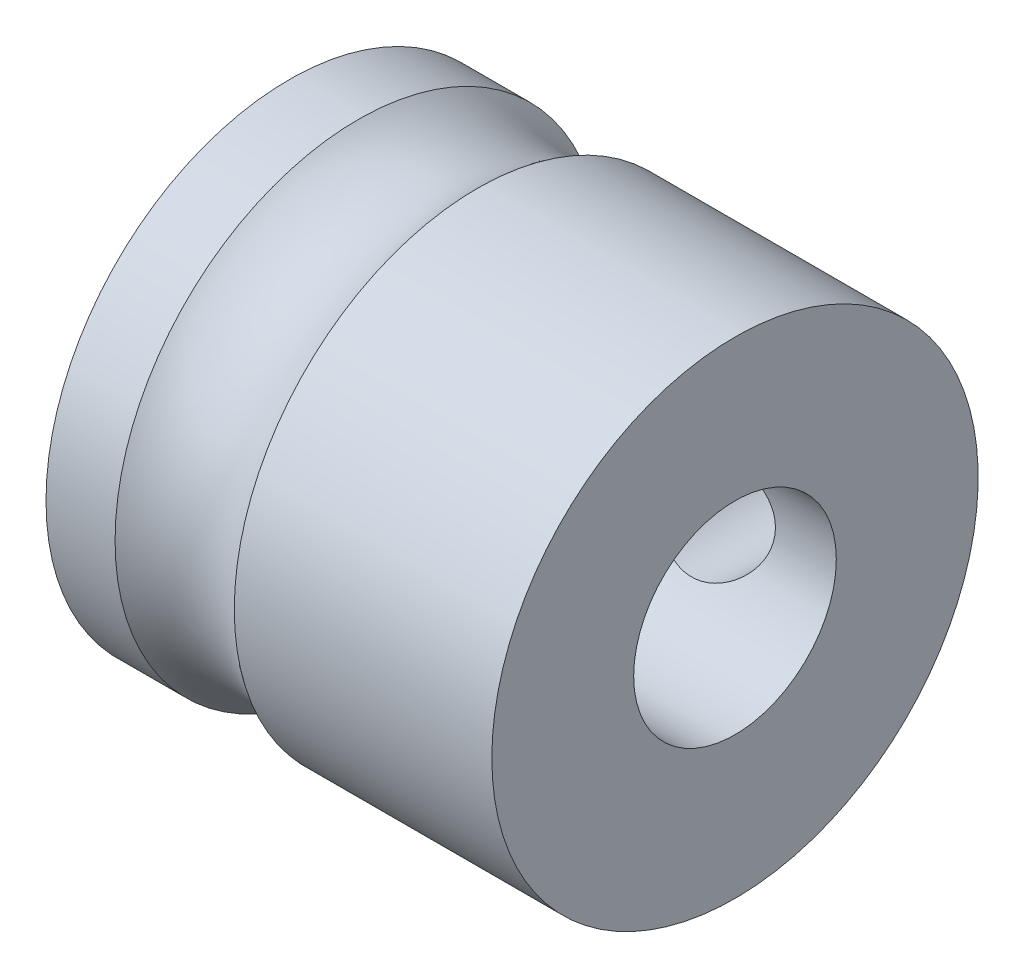
ISO-10303-21;
HEADER;
FILE_DESCRIPTION(('STEP AP214'),'2;1');
FILE_NAME('part.step','',(''),(''),'','','');
FILE_SCHEMA(('AUTOMOTIVE_DESIGN { 1 0 10303 214 1 1 1 1 }'));
ENDSEC;
DATA;
#1=APPLICATION_CONTEXT('core data for automotive mechanical design processes');
#2=APPLICATION_PROTOCOL_DEFINITION('international standard','automotive_design',2000,#1);
#3=PRODUCT_CONTEXT('',#1,'mechanical');
#4=PRODUCT('Part','Part','',(#3));
#5=PRODUCT_RELATED_PRODUCT_CATEGORY('part','',(#4));
#6=PRODUCT_DEFINITION_FORMATION('','',#4);
#7=PRODUCT_DEFINITION_CONTEXT('part definition',#1,'design');
#8=PRODUCT_DEFINITION('design','',#6,#7);
#9=PRODUCT_DEFINITION_SHAPE('','',#8);
#10=(LENGTH_UNIT() NAMED_UNIT(*) SI_UNIT(.MILLI.,.METRE.));
#11=(NAMED_UNIT(*) PLANE_ANGLE_UNIT() SI_UNIT($,.RADIAN.));
#12=(NAMED_UNIT(*) SI_UNIT($,.STERADIAN.) SOLID_ANGLE_UNIT());
#13=UNCERTAINTY_MEASURE_WITH_UNIT(LENGTH_MEASURE(1.E-05),#10,'distance_accuracy_value','');
#14=(GEOMETRIC_REPRESENTATION_CONTEXT(3) GLOBAL_UNCERTAINTY_ASSIGNED_CONTEXT((#13)) GLOBAL_UNIT_ASSIGNED_CONTEXT((#10,
#11,#12)) REPRESENTATION_CONTEXT('',''));
#15=CARTESIAN_POINT('',(0.,0.,0.));
#16=DIRECTION('',(0.,0.,1.));
#17=DIRECTION('',(1.,0.,0.));
#18=AXIS2_PLACEMENT_3D('',#15,#16,#17);
#19=CARTESIAN_POINT('',(8.32723341135728,-32.5543844318017,-4.45822777406187));
#20=DIRECTION('',(-1.,0.,0.));
#21=DIRECTION('',(0.,0.,1.));
#22=AXIS2_PLACEMENT_3D('',#19,#20,#21);
#23=CYLINDRICAL_SURFACE('',#22,6.);
#24=CARTESIAN_POINT('',(5.32723341135728,-31.3291039174701,-10.3317861215374));
#25=CARTESIAN_POINT('',(5.41006386191205,-31.3291063420355,-10.3317875904002));
#26=CARTESIAN_POINT('',(5.49292035056408,-31.3360647348139,-10.3332513798351));
#27=CARTESIAN_POINT('',(5.65625395826171,-31.3636628819093,-10.338905774862));
#28=CARTESIAN_POINT('',(5.73672966403828,-31.3843105986884,-10.343097967417));
#29=CARTESIAN_POINT('',(5.89291553426951,-31.438556564124,-10.3536230034425));
#30=CARTESIAN_POINT('',(5.96863170458869,-31.472138094385,-10.3599530821621));
#31=CARTESIAN_POINT('',(6.11341992288124,-31.5512165154294,-10.3739068929314));
#32=CARTESIAN_POINT('',(6.18249168860543,-31.5967139120843,-10.3815306798989));
#33=CARTESIAN_POINT('',(6.31355039851462,-31.6993638740588,-10.3972244690559));
#34=CARTESIAN_POINT('',(6.37536957156732,-31.756729788891,-10.405300323528));
#35=CARTESIAN_POINT('',(6.4886902479735,-31.8809813377146,-10.4206467811149));
#36=CARTESIAN_POINT('',(6.54019078673035,-31.9478678607038,-10.4279173089186));
#37=CARTESIAN_POINT('',(6.63209869193606,-32.0903770696231,-10.4406919892012));
#38=CARTESIAN_POINT('',(6.67234124425418,-32.166108631902,-10.4461700792424));
#39=CARTESIAN_POINT('',(6.73951919784915,-32.3234032812268,-10.4542965183451));
#40=CARTESIAN_POINT('',(6.76645656250661,-32.4049655058362,-10.4569452849828));
#41=CARTESIAN_POINT('',(6.80572211210445,-32.5698282082801,-10.4587624730377));
#42=CARTESIAN_POINT('',(6.81833519795325,-32.6530599994661,-10.4580003129882));
#43=CARTESIAN_POINT('',(6.82948843892263,-32.8203481570295,-10.4529138801677));
#44=CARTESIAN_POINT('',(6.82803067468306,-32.9044043996599,-10.4485901341307));
#45=CARTESIAN_POINT('',(6.81128850120722,-33.068985411569,-10.4366762903672));
#46=CARTESIAN_POINT('',(6.79631161632499,-33.1495471553711,-10.4291608003135));
#47=CARTESIAN_POINT('',(6.7534506493282,-33.3068385368207,-10.4113850227331));
#48=CARTESIAN_POINT('',(6.72556588013086,-33.3835679702346,-10.4011245891062));
#49=CARTESIAN_POINT('',(6.65743186894506,-33.5318467010887,-10.3785527592942));
#50=CARTESIAN_POINT('',(6.61707318456025,-33.6033429293533,-10.366223669345));
#51=CARTESIAN_POINT('',(6.52522000388754,-33.7385950496516,-10.3406074328341));
#52=CARTESIAN_POINT('',(6.47372357022093,-33.8023495920255,-10.3273201198607));
#53=CARTESIAN_POINT('',(6.35940816616787,-33.9221640516547,-10.3005777921152));
#54=CARTESIAN_POINT('',(6.29632047594863,-33.9779690163675,-10.2871279714617));
#55=CARTESIAN_POINT('',(6.16147342723314,-34.0783129384575,-10.2617033692451));
#56=CARTESIAN_POINT('',(6.08971366366269,-34.1228513692718,-10.2497286566375));
#57=CARTESIAN_POINT('',(5.93905939086791,-34.1995991957996,-10.2283984848488));
#58=CARTESIAN_POINT('',(5.86013197316937,-34.2317477620558,-10.2190560077171));
#59=CARTESIAN_POINT('',(5.69768213051142,-34.2823933819438,-10.2040688956096));
#60=CARTESIAN_POINT('',(5.61416069296741,-34.3008933569095,-10.1984234693488));
#61=CARTESIAN_POINT('',(5.44725771044341,-34.3233196246998,-10.1915517082663));
#62=CARTESIAN_POINT('',(5.36393073535951,-34.3276179343977,-10.1902125939344));
#63=CARTESIAN_POINT('',(5.19774024941039,-34.3225419272838,-10.1917804396814));
#64=CARTESIAN_POINT('',(5.11487669658653,-34.3131688690864,-10.1946870088941));
#65=CARTESIAN_POINT('',(4.95336485238445,-34.2813322566845,-10.2043497327541));
#66=CARTESIAN_POINT('',(4.87466977541477,-34.2590853922777,-10.2110421241797));
#67=CARTESIAN_POINT('',(4.72217453664626,-34.2023509895572,-10.2275495331616));
#68=CARTESIAN_POINT('',(4.64837495592407,-34.167862001225,-10.2373649206067));
#69=CARTESIAN_POINT('',(4.50616864463686,-34.0868113356005,-10.2593879230706));
#70=CARTESIAN_POINT('',(4.43789610733141,-34.0400260984926,-10.2716386895988));
#71=CARTESIAN_POINT('',(4.31012039367645,-33.9359520857033,-10.2972462494891));
#72=CARTESIAN_POINT('',(4.25061866136722,-33.8786615838938,-10.310603224415));
#73=CARTESIAN_POINT('',(4.14054678581469,-33.7534484485421,-10.3375508985416));
#74=CARTESIAN_POINT('',(4.09023737382798,-33.6852956532973,-10.3511390835122));
#75=CARTESIAN_POINT('',(4.00187189118652,-33.541226566148,-10.3769683696676));
#76=CARTESIAN_POINT('',(3.96381518139234,-33.4653106794628,-10.3892095410949));
#77=CARTESIAN_POINT('',(3.9013657906405,-33.3083609337408,-10.4111889243519));
#78=CARTESIAN_POINT('',(3.87687484072982,-33.2273687426716,-10.4209448528914));
#79=CARTESIAN_POINT('',(3.84195721059221,-33.0621026223407,-10.4372836627148));
#80=CARTESIAN_POINT('',(3.83152781611383,-32.9778293296504,-10.4438671562048));
#81=CARTESIAN_POINT('',(3.82518202699395,-32.8108283854292,-10.4533127534765));
#82=CARTESIAN_POINT('',(3.82888084771417,-32.728120552557,-10.4562706648983));
#83=CARTESIAN_POINT('',(3.84980515229875,-32.5643869413315,-10.4587781389341));
#84=CARTESIAN_POINT('',(3.86703023387691,-32.483361113027,-10.4583278029099));
#85=CARTESIAN_POINT('',(3.91431174101365,-32.3257113365278,-10.4543847520449));
#86=CARTESIAN_POINT('',(3.9442985913292,-32.2490660395188,-10.4509084285474));
#87=CARTESIAN_POINT('',(4.01618927988625,-32.1017431742204,-10.4415855786131));
#88=CARTESIAN_POINT('',(4.05809462036161,-32.0310663596694,-10.4357387533533));
#89=CARTESIAN_POINT('',(4.15380626235287,-31.8958856058852,-10.4223796460682));
#90=CARTESIAN_POINT('',(4.20787362571833,-31.8315701158581,-10.4148308201873));
#91=CARTESIAN_POINT('',(4.32586768931796,-31.7127746304271,-10.3992117599924));
#92=CARTESIAN_POINT('',(4.38979688550413,-31.6582971325389,-10.3911413939821));
#93=CARTESIAN_POINT('',(4.52713553265927,-31.5597671851784,-10.3754296562265));
#94=CARTESIAN_POINT('',(4.60069959647621,-31.5159281852903,-10.3677990966118));
#95=CARTESIAN_POINT('',(4.75431664624132,-31.4413920098314,-10.3542173721458));
#96=CARTESIAN_POINT('',(4.83436486051738,-31.4106852729001,-10.3482649865263));
#97=CARTESIAN_POINT('',(4.98309892909734,-31.3678885179081,-10.3397755785984));
#98=CARTESIAN_POINT('',(5.05107315793306,-31.3533769232045,-10.3368056957255));
#99=CARTESIAN_POINT('',(5.18843671485722,-31.3339840178978,-10.3328104347154));
#100=CARTESIAN_POINT('',(5.25782592172487,-31.329101885814,-10.3317848907089));
#101=CARTESIAN_POINT('',(5.32723341135728,-31.3291039174701,-10.3317861215374));
#102=B_SPLINE_CURVE_WITH_KNOTS('',3,(#24,#25,#26,#27,#28,#29,#30,#31,#32,#33,#34,#35,#36,#37,
#38,#39,#40,#41,#42,#43,#44,#45,#46,#47,#48,#49,#50,#51,#52,#53,#54,#55,#56,#57,#58,#59,#60,#61,
#62,#63,#64,#65,#66,#67,#68,#69,#70,#71,#72,#73,#74,#75,#76,#77,#78,#79,#80,#81,#82,#83,#84,#85,
#86,#87,#88,#89,#90,#91,#92,#93,#94,#95,#96,#97,#98,#99,#100,#101),.UNSPECIFIED.,.T.,.F.,(4,2,2,
2,2,2,2,2,2,2,2,2,2,2,2,2,2,2,2,2,2,2,2,2,2,2,2,2,2,2,2,2,2,2,2,2,2,2,4),(0.,0.248236465041685,
0.496617444857207,0.744678436299622,0.992749960532884,1.24574372515787,1.49876112887922,
1.75530897838755,2.01181895908258,2.26313250597212,2.51440889199616,2.76010957613373,
3.00582334034876,3.25375724552672,3.50173431281354,3.75642279943153,4.01112318719887,
4.26705859205048,4.52293920077735,4.77206144857037,5.02116076310289,5.26618443005532,
5.51123712852859,5.76109707515503,6.01099811331035,6.267151985792,6.52329249431741,
6.77755243684167,7.03176329345434,7.27910067676485,7.526430704262,7.77242925935839,
8.01845883442856,8.27038257949256,8.52237018939319,8.7790588637082,9.03556032819985,
9.24358696306412,9.45159585059727),.UNSPECIFIED.);
#103=CARTESIAN_POINT('',(5.32723341135728,-31.3291039174701,-10.3317861215374));
#104=VERTEX_POINT('',#103);
#105=EDGE_CURVE('E56',#104,#104,#102,.T.);
#106=ORIENTED_EDGE('',*,*,#105,.F.);
#107=EDGE_LOOP('',(#106));
#108=FACE_BOUND('',#107,.T.);
#109=CARTESIAN_POINT('',(8.32723341135728,-32.5543844318017,-4.45822777406187));
#110=DIRECTION('',(-1.,0.,0.));
#111=DIRECTION('',(0.,0.,1.));
#112=AXIS2_PLACEMENT_3D('',#109,#110,#111);
#113=CIRCLE('',#112,6.);
#114=CARTESIAN_POINT('',(8.32723341135728,-32.5543844318017,1.54177222593812));
#115=VERTEX_POINT('',#114);
#116=EDGE_CURVE('E45',#115,#115,#113,.T.);
#117=ORIENTED_EDGE('',*,*,#116,.T.);
#118=EDGE_LOOP('',(#117));
#119=FACE_BOUND('',#118,.T.);
#120=CARTESIAN_POINT('',(1.97294752361704,-32.5543844318017,-4.45822777406187));
#121=DIRECTION('',(-1.,0.,0.));
#122=DIRECTION('',(0.,0.,1.));
#123=AXIS2_PLACEMENT_3D('',#120,#121,#122);
#124=CIRCLE('',#123,6.);
#125=CARTESIAN_POINT('',(1.97294752361704,-32.5543844318017,1.54177222593812));
#126=VERTEX_POINT('',#125);
#127=EDGE_CURVE('E10',#126,#126,#124,.T.);
#128=ORIENTED_EDGE('',*,*,#127,.F.);
#129=EDGE_LOOP('',(#128));
#130=FACE_BOUND('',#129,.T.);
#131=ADVANCED_FACE('F30',(#108,#119,#130),#23,.T.);
#132=CARTESIAN_POINT('',(0.502233411357282,-32.5543844318017,-4.45822777406187));
#133=DIRECTION('',(-1.,0.,0.));
#134=DIRECTION('',(0.,0.,1.));
#135=AXIS2_PLACEMENT_3D('',#132,#133,#134);
#136=TOROIDAL_SURFACE('',#135,7.913,2.413);
#137=ORIENTED_EDGE('',*,*,#127,.T.);
#138=EDGE_LOOP('',(#137));
#139=FACE_BOUND('',#138,.T.);
#140=CARTESIAN_POINT('',(-0.968480700902476,-32.5543844318017,-4.45822777406187));
#141=DIRECTION('',(-1.,0.,0.));
#142=DIRECTION('',(0.,0.,1.));
#143=AXIS2_PLACEMENT_3D('',#140,#141,#142);
#144=CIRCLE('',#143,6.);
#145=CARTESIAN_POINT('',(-0.968480700902476,-32.5543844318017,1.54177222593812));
#146=VERTEX_POINT('',#145);
#147=EDGE_CURVE('E37',#146,#146,#144,.T.);
#148=ORIENTED_EDGE('',*,*,#147,.F.);
#149=EDGE_LOOP('',(#148));
#150=FACE_BOUND('',#149,.T.);
#151=ADVANCED_FACE('F87',(#139,#150),#136,.F.);
#152=CARTESIAN_POINT('',(8.32723341135728,-32.5543844318017,-4.45822777406187));
#153=DIRECTION('',(-1.,0.,0.));
#154=DIRECTION('',(0.,0.,1.));
#155=AXIS2_PLACEMENT_3D('',#152,#153,#154);
#156=CYLINDRICAL_SURFACE('',#155,6.);
#157=ORIENTED_EDGE('',*,*,#147,.T.);
#158=EDGE_LOOP('',(#157));
#159=FACE_BOUND('',#158,.T.);
#160=CARTESIAN_POINT('',(-2.67276658864272,-32.5543844318017,-4.45822777406187));
#161=DIRECTION('',(-1.,0.,0.));
#162=DIRECTION('',(0.,0.,1.));
#163=AXIS2_PLACEMENT_3D('',#160,#161,#162);
#164=CIRCLE('',#163,6.);
#165=CARTESIAN_POINT('',(-2.67276658864272,-32.5543844318017,1.54177222593812));
#166=VERTEX_POINT('',#165);
#167=EDGE_CURVE('E41',#166,#166,#164,.T.);
#168=ORIENTED_EDGE('',*,*,#167,.F.);
#169=EDGE_LOOP('',(#168));
#170=FACE_BOUND('',#169,.T.);
#171=ADVANCED_FACE('F84',(#159,#170),#156,.T.);
#172=CARTESIAN_POINT('',(-2.67276658864272,-32.5543844318017,-4.45822777406187));
#173=DIRECTION('',(-1.,0.,0.));
#174=DIRECTION('',(0.,0.,1.));
#175=AXIS2_PLACEMENT_3D('',#172,#173,#174);
#176=PLANE('',#175);
#177=CARTESIAN_POINT('',(-2.67276658864272,-32.5543844318017,-4.45822777406187));
#178=DIRECTION('',(-1.,0.,0.));
#179=DIRECTION('',(0.,0.,1.));
#180=AXIS2_PLACEMENT_3D('',#177,#178,#179);
#181=CIRCLE('',#180,2.49999999999999);
#182=CARTESIAN_POINT('',(-2.67276658864272,-32.5543844318017,-1.95822777406189));
#183=VERTEX_POINT('',#182);
#184=EDGE_CURVE('E53',#183,#183,#181,.T.);
#185=ORIENTED_EDGE('',*,*,#184,.F.);
#186=EDGE_LOOP('',(#185));
#187=FACE_BOUND('',#186,.T.);
#188=ORIENTED_EDGE('',*,*,#167,.T.);
#189=EDGE_LOOP('',(#188));
#190=FACE_BOUND('',#189,.T.);
#191=ADVANCED_FACE('F80',(#187,#190),#176,.T.);
#192=CARTESIAN_POINT('',(8.32723341135728,-26.5543844318017,-4.45822777406187));
#193=DIRECTION('',(1.,0.,0.));
#194=DIRECTION('',(0.,0.,-1.));
#195=AXIS2_PLACEMENT_3D('',#192,#193,#194);
#196=PLANE('',#195);
#197=CARTESIAN_POINT('',(8.32723341135728,-32.5543844318017,-4.45822777406187));
#198=DIRECTION('',(-1.,0.,0.));
#199=DIRECTION('',(0.,0.,1.));
#200=AXIS2_PLACEMENT_3D('',#197,#198,#199);
#201=CIRCLE('',#200,2.49999999999999);
#202=CARTESIAN_POINT('',(8.32723341135728,-32.5543844318017,-1.95822777406189));
#203=VERTEX_POINT('',#202);
#204=EDGE_CURVE('E50',#203,#203,#201,.T.);
#205=ORIENTED_EDGE('',*,*,#204,.T.);
#206=EDGE_LOOP('',(#205));
#207=FACE_BOUND('',#206,.T.);
#208=ORIENTED_EDGE('',*,*,#116,.F.);
#209=EDGE_LOOP('',(#208));
#210=FACE_BOUND('',#209,.T.);
#211=ADVANCED_FACE('F76',(#207,#210),#196,.T.);
#212=CARTESIAN_POINT('',(-2.67276658864272,-32.5543844318017,-4.45822777406187));
#213=DIRECTION('',(-1.,0.,0.));
#214=DIRECTION('',(0.,0.,1.));
#215=AXIS2_PLACEMENT_3D('',#212,#213,#214);
#216=CYLINDRICAL_SURFACE('',#215,2.49999999999999);
#217=CARTESIAN_POINT('',(5.32723341135728,-31.1500479058204,-6.52652149638348));
#218=CARTESIAN_POINT('',(5.40271238664692,-31.1500435950065,-6.52651585919849));
#219=CARTESIAN_POINT('',(5.47817184543708,-31.1559768630117,-6.53058364746183));
#220=CARTESIAN_POINT('',(5.6265573153195,-31.17925060709,-6.54609642869731));
#221=CARTESIAN_POINT('',(5.69948059874238,-31.1966029879555,-6.55754912041762));
#222=CARTESIAN_POINT('',(5.84031705303456,-31.2415056343114,-6.58591175759683));
#223=CARTESIAN_POINT('',(5.90826224939255,-31.2689822789068,-6.60278219563873));
#224=CARTESIAN_POINT('',(6.0386708647252,-31.3330503817475,-6.63990423207546));
#225=CARTESIAN_POINT('',(6.10113264105242,-31.3696445587824,-6.6601568384161));
#226=CARTESIAN_POINT('',(6.22718242802137,-31.4560443828271,-6.7046215933243));
#227=CARTESIAN_POINT('',(6.28997436848123,-31.5069183072855,-6.72901510141724));
#228=CARTESIAN_POINT('',(6.40699817409905,-31.6180732898447,-6.77706219306995));
#229=CARTESIAN_POINT('',(6.46122356302809,-31.6783613971606,-6.8007152060939));
#230=CARTESIAN_POINT('',(6.56536722106699,-31.8144222284541,-6.84740437163864));
#231=CARTESIAN_POINT('',(6.61418787502705,-31.8911640845944,-6.87009802832327));
#232=CARTESIAN_POINT('',(6.69804313380173,-32.0533660313583,-6.908923527492));
#233=CARTESIAN_POINT('',(6.73309038548001,-32.1388180330045,-6.92506139002712));
#234=CARTESIAN_POINT('',(6.78482933416995,-32.3073333866566,-6.94730077374444));
#235=CARTESIAN_POINT('',(6.8029537723246,-32.3898461973193,-6.95421324153261));
#236=CARTESIAN_POINT('',(6.82517621422042,-32.5569892232866,-6.95961937894598));
#237=CARTESIAN_POINT('',(6.82928738935736,-32.6416173749063,-6.9581209576728));
#238=CARTESIAN_POINT('',(6.82361966401484,-32.7992858370788,-6.94730147851664));
#239=CARTESIAN_POINT('',(6.81549988518799,-32.8724618225112,-6.93897344546431));
#240=CARTESIAN_POINT('',(6.7887536157092,-33.0158965862856,-6.91633218554204));
#241=CARTESIAN_POINT('',(6.77012634745015,-33.0861551483105,-6.90201851572514));
#242=CARTESIAN_POINT('',(6.72306784865353,-33.222461592564,-6.86833910330178));
#243=CARTESIAN_POINT('',(6.69458035021831,-33.2884826728199,-6.84894452411326));
#244=CARTESIAN_POINT('',(6.62884879513177,-33.4146985005207,-6.80648236706394));
#245=CARTESIAN_POINT('',(6.5916024642983,-33.4748917290564,-6.78341383578481));
#246=CARTESIAN_POINT('',(6.50439431855285,-33.5954917594687,-6.73218534389996));
#247=CARTESIAN_POINT('',(6.45344509962157,-33.6550652866525,-6.70374635879543));
#248=CARTESIAN_POINT('',(6.34282929349713,-33.7652823036439,-6.64628605519126));
#249=CARTESIAN_POINT('',(6.2831509078828,-33.8159134991592,-6.61726399513935));
#250=CARTESIAN_POINT('',(6.14858000519375,-33.9128204070576,-6.5578087703973));
#251=CARTESIAN_POINT('',(6.07272583481784,-33.9579113874926,-6.52760184446448));
#252=CARTESIAN_POINT('',(5.9125271797207,-34.0347107336315,-6.47338431797078));
#253=CARTESIAN_POINT('',(5.82819869523166,-34.066443753383,-6.44936233432532));
#254=CARTESIAN_POINT('',(5.67483977946195,-34.1089116396511,-6.41628341329216));
#255=CARTESIAN_POINT('',(5.60719277906066,-34.1229005128406,-6.40499365330478));
#256=CARTESIAN_POINT('',(5.46985980105782,-34.1417309649896,-6.38967425917864));
#257=CARTESIAN_POINT('',(5.40017629087273,-34.1465831823734,-6.38563618167113));
#258=CARTESIAN_POINT('',(5.26068172892159,-34.1468746151504,-6.38539539945243));
#259=CARTESIAN_POINT('',(5.19087063414209,-34.1423007895579,-6.38920355004201));
#260=CARTESIAN_POINT('',(5.05324606760874,-34.123984428121,-6.40411806020672));
#261=CARTESIAN_POINT('',(4.98543421911704,-34.1102346450229,-6.4152301884244));
#262=CARTESIAN_POINT('',(4.85351883187751,-34.0742514099928,-6.44330143414142));
#263=CARTESIAN_POINT('',(4.78941077482506,-34.0520285573504,-6.46025324401158));
#264=CARTESIAN_POINT('',(4.66575569562711,-33.9998317467918,-6.49825781804492));
#265=CARTESIAN_POINT('',(4.60621040499129,-33.9698548650217,-6.51931212841988));
#266=CARTESIAN_POINT('',(4.48199332884504,-33.8966998689128,-6.56783500286627));
#267=CARTESIAN_POINT('',(4.41833257626072,-33.8521161167478,-6.5957756476652));
#268=CARTESIAN_POINT('',(4.29894792650783,-33.7537208167332,-6.6524983491788));
#269=CARTESIAN_POINT('',(4.24323171918817,-33.6999004379048,-6.68128118905196));
#270=CARTESIAN_POINT('',(4.13400940400685,-33.5760891540572,-6.74108415547078));
#271=CARTESIAN_POINT('',(4.08173268475144,-33.5049055835642,-6.77190855104228));
#272=CARTESIAN_POINT('',(3.99033063452062,-33.3527886598573,-6.82869687059812));
#273=CARTESIAN_POINT('',(3.95119658351635,-33.271861819827,-6.85466401223404));
#274=CARTESIAN_POINT('',(3.8903652079259,-33.1084851189707,-6.89740216791787));
#275=CARTESIAN_POINT('',(3.86760718356616,-33.0265735729947,-6.91470444330191));
#276=CARTESIAN_POINT('',(3.836518808511,-32.8588045361502,-6.94107070814039));
#277=CARTESIAN_POINT('',(3.82817212063964,-32.7729516268869,-6.95014402067499));
#278=CARTESIAN_POINT('',(3.82655880277133,-32.612164611362,-6.95868155625979));
#279=CARTESIAN_POINT('',(3.83143007679422,-32.5373007590091,-6.95926558004821));
#280=CARTESIAN_POINT('',(3.85212723573887,-32.3893555753029,-6.95387237012725));
#281=CARTESIAN_POINT('',(3.86795324267885,-32.3162742638136,-6.94789506333469));
#282=CARTESIAN_POINT('',(3.90945298294103,-32.1750133131985,-6.93028577992935));
#283=CARTESIAN_POINT('',(3.93496500748649,-32.1067739329432,-6.91874586112509));
#284=CARTESIAN_POINT('',(3.994874005912,-31.9753174611772,-6.89116790959421));
#285=CARTESIAN_POINT('',(4.02927297221684,-31.9121015000628,-6.87512886810897));
#286=CARTESIAN_POINT('',(4.110158607926,-31.7851241711766,-6.83794966077005));
#287=CARTESIAN_POINT('',(4.15755212037411,-31.7220486206576,-6.816444740217));
#288=CARTESIAN_POINT('',(4.26098644507496,-31.6041654025981,-6.77146649737741));
#289=CARTESIAN_POINT('',(4.31703683696515,-31.5493670290328,-6.74799100777359));
#290=CARTESIAN_POINT('',(4.44451897353493,-31.4425329212521,-6.69824533339095));
#291=CARTESIAN_POINT('',(4.51699989752273,-31.3917287714966,-6.67199826760847));
#292=CARTESIAN_POINT('',(4.67071826412378,-31.303192909907,-6.62319474385801));
#293=CARTESIAN_POINT('',(4.75195112533865,-31.2654544017454,-6.60063637038298));
#294=CARTESIAN_POINT('',(4.91429769649444,-31.2075329729885,-6.56466172166067));
#295=CARTESIAN_POINT('',(4.99482864731849,-31.1861256422577,-6.55062904456246));
#296=CARTESIAN_POINT('',(5.15933080606094,-31.1574007284163,-6.53157179810557));
#297=CARTESIAN_POINT('',(5.24329417711598,-31.1500526998232,-6.52652776542715));
#298=CARTESIAN_POINT('',(5.32723341135728,-31.1500479058204,-6.52652149638348));
#299=B_SPLINE_CURVE_WITH_KNOTS('',3,(#217,#218,#219,#220,#221,#222,#223,#224,#225,#226,#227,
#228,#229,#230,#231,#232,#233,#234,#235,#236,#237,#238,#239,#240,#241,#242,#243,#244,#245,#246,
#247,#248,#249,#250,#251,#252,#253,#254,#255,#256,#257,#258,#259,#260,#261,#262,#263,#264,#265,
#266,#267,#268,#269,#270,#271,#272,#273,#274,#275,#276,#277,#278,#279,#280,#281,#282,#283,#284,
#285,#286,#287,#288,#289,#290,#291,#292,#293,#294,#295,#296,#297,#298),.UNSPECIFIED.,.T.,.F.,(4,
2,2,2,2,2,2,2,2,2,2,2,2,2,2,2,2,2,2,2,2,2,2,2,2,2,2,2,2,2,2,2,2,2,2,2,2,2,2,2,4),(0.,
0.226085249493394,0.452406574330775,0.677113624991879,0.901887762215941,1.15414462390003,
1.40659128601845,1.68630157736225,1.96575443271223,2.21853330858501,2.4710745260277,
2.69230130543185,2.91354445887948,3.1360715503638,3.35865648368883,3.60782810055853,
3.85733966656913,4.13576671140282,4.41367760154774,4.6227629805469,4.83160475643983,
5.04073566011188,5.25003193304134,5.45906724365502,5.66818149154667,5.91499438482009,
6.16204457978461,6.44121828011596,6.72020638384856,6.97891479383346,7.23732973022735,
7.46129321849408,7.68525920139658,7.90563970188766,8.12606965394595,8.37042963549498,
8.61506198741965,8.89071695766614,9.16622832484816,9.41820120134368,9.66962780912293),.UNSPECIFIED.);
#300=CARTESIAN_POINT('',(5.32723341135728,-31.1500479058204,-6.52652149638348));
#301=VERTEX_POINT('',#300);
#302=EDGE_CURVE('E62',#301,#301,#299,.T.);
#303=ORIENTED_EDGE('',*,*,#302,.T.);
#304=EDGE_LOOP('',(#303));
#305=FACE_BOUND('',#304,.T.);
#306=ORIENTED_EDGE('',*,*,#204,.F.);
#307=EDGE_LOOP('',(#306));
#308=FACE_BOUND('',#307,.T.);
#309=ORIENTED_EDGE('',*,*,#184,.T.);
#310=EDGE_LOOP('',(#309));
#311=FACE_BOUND('',#310,.T.);
#312=ADVANCED_FACE('F69',(#305,#308,#311),#216,.F.);
#313=CARTESIAN_POINT('',(5.32723341135728,-32.8364012620609,-10.4515963183323));
#314=DIRECTION('',(0.,-0.0470028050432147,-0.998894757378408));
#315=DIRECTION('',(0.,0.998894757378408,-0.0470028050432147));
#316=AXIS2_PLACEMENT_3D('',#313,#314,#315);
#317=CYLINDRICAL_SURFACE('',#316,1.50000000000002);
#318=ORIENTED_EDGE('',*,*,#105,.T.);
#319=EDGE_LOOP('',(#318));
#320=FACE_BOUND('',#319,.T.);
#321=ORIENTED_EDGE('',*,*,#302,.F.);
#322=EDGE_LOOP('',(#321));
#323=FACE_BOUND('',#322,.T.);
#324=ADVANCED_FACE('F66',(#320,#323),#317,.F.);
#325=CLOSED_SHELL('',(#131,#151,#171,#191,#211,#312,#324));
#326=MANIFOLD_SOLID_BREP('B2',#325);
#327=ADVANCED_BREP_SHAPE_REPRESENTATION('',(#18,#326),#14);
#328=SHAPE_DEFINITION_REPRESENTATION(#9,#327);
ENDSEC;
END-ISO-10303-21;
